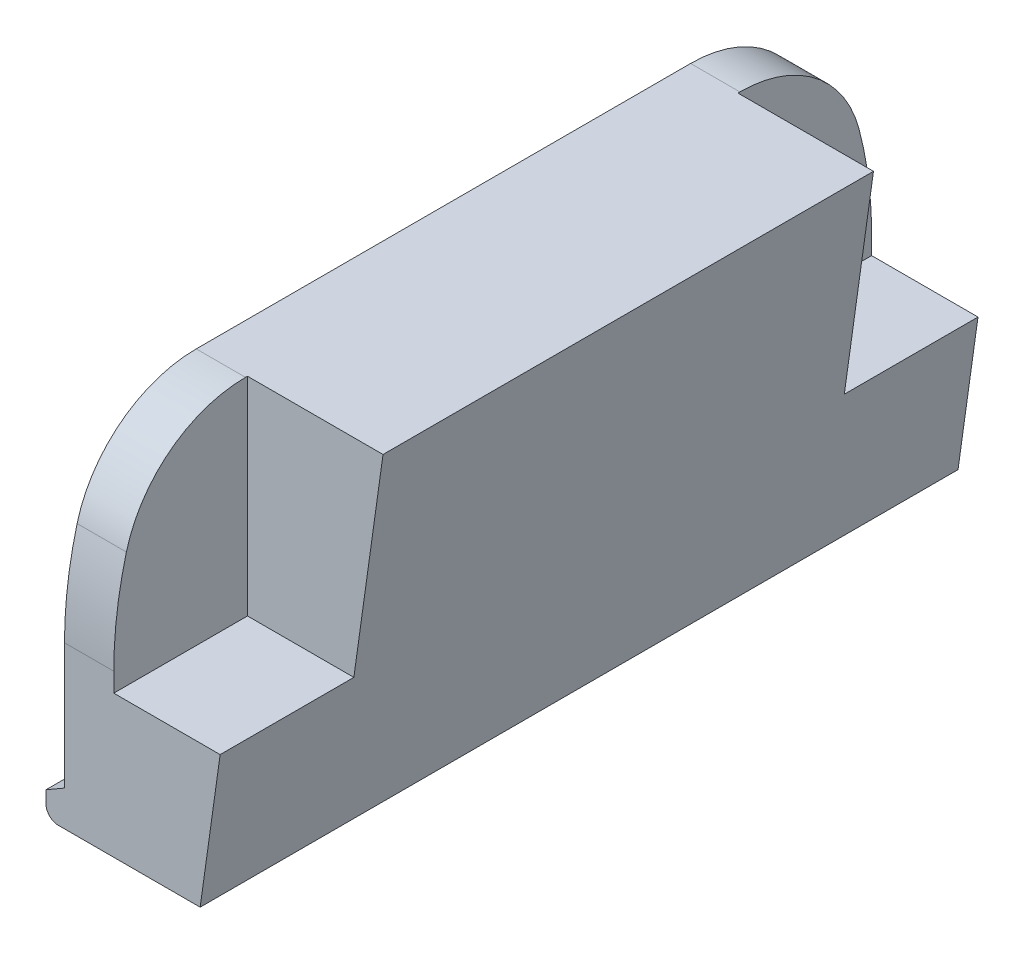
ISO-10303-21;
HEADER;
FILE_DESCRIPTION(('STEP AP214'),'2;1');
FILE_NAME('part.step','',(''),(''),'','','');
FILE_SCHEMA(('AUTOMOTIVE_DESIGN { 1 0 10303 214 1 1 1 1 }'));
ENDSEC;
DATA;
#1=APPLICATION_CONTEXT('core data for automotive mechanical design processes');
#2=APPLICATION_PROTOCOL_DEFINITION('international standard','automotive_design',2000,#1);
#3=PRODUCT_CONTEXT('',#1,'mechanical');
#4=PRODUCT('Part','Part','',(#3));
#5=PRODUCT_RELATED_PRODUCT_CATEGORY('part','',(#4));
#6=PRODUCT_DEFINITION_FORMATION('','',#4);
#7=PRODUCT_DEFINITION_CONTEXT('part definition',#1,'design');
#8=PRODUCT_DEFINITION('design','',#6,#7);
#9=PRODUCT_DEFINITION_SHAPE('','',#8);
#10=(LENGTH_UNIT() NAMED_UNIT(*) SI_UNIT(.MILLI.,.METRE.));
#11=(NAMED_UNIT(*) PLANE_ANGLE_UNIT() SI_UNIT($,.RADIAN.));
#12=(NAMED_UNIT(*) SI_UNIT($,.STERADIAN.) SOLID_ANGLE_UNIT());
#13=UNCERTAINTY_MEASURE_WITH_UNIT(LENGTH_MEASURE(1.E-05),#10,'distance_accuracy_value','');
#14=(GEOMETRIC_REPRESENTATION_CONTEXT(3) GLOBAL_UNCERTAINTY_ASSIGNED_CONTEXT((#13)) GLOBAL_UNIT_ASSIGNED_CONTEXT((#10,
#11,#12)) REPRESENTATION_CONTEXT('',''));
#15=CARTESIAN_POINT('',(0.,0.,0.));
#16=DIRECTION('',(0.,0.,1.));
#17=DIRECTION('',(1.,0.,0.));
#18=AXIS2_PLACEMENT_3D('',#15,#16,#17);
#19=CARTESIAN_POINT('',(0.299997713090983,1.78159871871872,12.3));
#20=DIRECTION('',(1.,0.,0.));
#21=DIRECTION('',(0.,0.,-1.));
#22=AXIS2_PLACEMENT_3D('',#19,#20,#21);
#23=PLANE('',#22);
#24=CARTESIAN_POINT('',(0.299997713090983,2.21592966698313,6.14964107341044));
#25=DIRECTION('',(1.,0.,0.));
#26=DIRECTION('',(0.,0.,1.));
#27=AXIS2_PLACEMENT_3D('',#24,#25,#26);
#28=CIRCLE('',#27,6.15035892658956);
#29=CARTESIAN_POINT('',(0.299997713090983,3.78899475901144,12.095427913024));
#30=VERTEX_POINT('',#29);
#31=CARTESIAN_POINT('',(0.299997713090983,2.21592966698313,12.3));
#32=VERTEX_POINT('',#31);
#33=EDGE_CURVE('E248',#30,#32,#28,.T.);
#34=ORIENTED_EDGE('',*,*,#33,.F.);
#35=CARTESIAN_POINT('',(0.299997713090983,3.27745872971482,10.1619515385287));
#36=DIRECTION('',(1.,0.,0.));
#37=DIRECTION('',(0.,0.,-1.));
#38=AXIS2_PLACEMENT_3D('',#35,#36,#37);
#39=CIRCLE('',#38,2.);
#40=CARTESIAN_POINT('',(0.299997713090983,5.27745872971482,10.1619515385287));
#41=VERTEX_POINT('',#40);
#42=EDGE_CURVE('E227',#30,#41,#39,.F.);
#43=ORIENTED_EDGE('',*,*,#42,.T.);
#44=DIRECTION('',(0.,0.,1.));
#45=VECTOR('',#44,1.);
#46=CARTESIAN_POINT('',(0.299997713090983,5.27745872971482,-0.552242211652792));
#47=LINE('',#46,#45);
#48=CARTESIAN_POINT('',(0.299997713090983,5.27745872971482,2.13804846147129));
#49=VERTEX_POINT('',#48);
#50=EDGE_CURVE('E318',#49,#41,#47,.T.);
#51=ORIENTED_EDGE('',*,*,#50,.F.);
#52=CARTESIAN_POINT('',(0.299997713090983,3.27745872971482,2.13804846147129));
#53=DIRECTION('',(1.,0.,0.));
#54=DIRECTION('',(0.,0.,-1.));
#55=AXIS2_PLACEMENT_3D('',#52,#53,#54);
#56=CIRCLE('',#55,2.);
#57=CARTESIAN_POINT('',(0.299997713090983,3.78899475901144,0.204572086976));
#58=VERTEX_POINT('',#57);
#59=EDGE_CURVE('E225',#49,#58,#56,.F.);
#60=ORIENTED_EDGE('',*,*,#59,.T.);
#61=CARTESIAN_POINT('',(0.299997713090983,2.21592966698313,6.15035892658956));
#62=DIRECTION('',(1.,0.,0.));
#63=DIRECTION('',(0.,0.,-1.));
#64=AXIS2_PLACEMENT_3D('',#61,#62,#63);
#65=CIRCLE('',#64,6.15035892658956);
#66=CARTESIAN_POINT('',(0.299997713090983,2.21592966698313,0.));
#67=VERTEX_POINT('',#66);
#68=EDGE_CURVE('E240',#67,#58,#65,.T.);
#69=ORIENTED_EDGE('',*,*,#68,.F.);
#70=DIRECTION('',(0.,-1.,0.));
#71=VECTOR('',#70,1.);
#72=CARTESIAN_POINT('',(0.299997713090983,1.78159871871872,0.));
#73=LINE('',#72,#71);
#74=CARTESIAN_POINT('',(0.299997713090983,0.173208718718719,0.));
#75=VERTEX_POINT('',#74);
#76=EDGE_CURVE('E200',#67,#75,#73,.T.);
#77=ORIENTED_EDGE('',*,*,#76,.T.);
#78=DIRECTION('',(0.,0.,-1.));
#79=VECTOR('',#78,1.);
#80=CARTESIAN_POINT('',(0.299997713090983,0.173208718718719,12.3));
#81=LINE('',#80,#79);
#82=CARTESIAN_POINT('',(0.299997713090983,0.173208718718719,12.3));
#83=VERTEX_POINT('',#82);
#84=EDGE_CURVE('E214',#83,#75,#81,.T.);
#85=ORIENTED_EDGE('',*,*,#84,.F.);
#86=DIRECTION('',(0.,-1.,0.));
#87=VECTOR('',#86,1.);
#88=CARTESIAN_POINT('',(0.299997713090982,6.10745871871872,12.3));
#89=LINE('',#88,#87);
#90=EDGE_CURVE('E294',#32,#83,#89,.T.);
#91=ORIENTED_EDGE('',*,*,#90,.F.);
#92=EDGE_LOOP('',(#34,#43,#51,#60,#69,#77,#85,#91));
#93=FACE_BOUND('',#92,.T.);
#94=DIRECTION('',(0.,0.,1.));
#95=VECTOR('',#94,1.);
#96=CARTESIAN_POINT('',(0.299997713090983,4.37320871871872,2.9660396702713));
#97=LINE('',#96,#95);
#98=CARTESIAN_POINT('',(0.299997713090983,4.37320871871872,4.65));
#99=VERTEX_POINT('',#98);
#100=CARTESIAN_POINT('',(0.299997713090983,4.37320871871872,7.65));
#101=VERTEX_POINT('',#100);
#102=EDGE_CURVE('E341',#99,#101,#97,.T.);
#103=ORIENTED_EDGE('',*,*,#102,.T.);
#104=DIRECTION('',(0.,1.,0.));
#105=VECTOR('',#104,1.);
#106=CARTESIAN_POINT('',(0.299997713090983,2.78159871871872,7.65));
#107=LINE('',#106,#105);
#108=CARTESIAN_POINT('',(0.299997713090983,1.78159871871872,7.65));
#109=VERTEX_POINT('',#108);
#110=EDGE_CURVE('E350',#109,#101,#107,.T.);
#111=ORIENTED_EDGE('',*,*,#110,.F.);
#112=DIRECTION('',(0.,0.,1.));
#113=VECTOR('',#112,1.);
#114=CARTESIAN_POINT('',(0.299997713090983,1.78159871871872,4.65));
#115=LINE('',#114,#113);
#116=CARTESIAN_POINT('',(0.299997713090983,1.78159871871872,4.65));
#117=VERTEX_POINT('',#116);
#118=EDGE_CURVE('E361',#117,#109,#115,.T.);
#119=ORIENTED_EDGE('',*,*,#118,.F.);
#120=DIRECTION('',(0.,-1.,0.));
#121=VECTOR('',#120,1.);
#122=CARTESIAN_POINT('',(0.299997713090983,2.78159871871872,4.65));
#123=LINE('',#122,#121);
#124=EDGE_CURVE('E340',#99,#117,#123,.T.);
#125=ORIENTED_EDGE('',*,*,#124,.F.);
#126=EDGE_LOOP('',(#103,#111,#119,#125));
#127=FACE_BOUND('',#126,.T.);
#128=ADVANCED_FACE('F33',(#93,#127),#23,.F.);
#129=CARTESIAN_POINT('',(0.2,-0.2,0.));
#130=DIRECTION('',(0.,0.,-1.));
#131=DIRECTION('',(-1.,0.,0.));
#132=AXIS2_PLACEMENT_3D('',#129,#130,#131);
#133=PLANE('',#132);
#134=DIRECTION('',(-0.139173100960058,-0.990268068741571,0.));
#135=VECTOR('',#134,1.);
#136=CARTESIAN_POINT('',(2.50208292422852,-0.4,0.));
#137=LINE('',#136,#135);
#138=CARTESIAN_POINT('',(2.82637509859855,1.90745871871872,0.));
#139=VERTEX_POINT('',#138);
#140=CARTESIAN_POINT('',(2.50208292422852,-0.4,0.));
#141=VERTEX_POINT('',#140);
#142=EDGE_CURVE('E178',#139,#141,#137,.T.);
#143=ORIENTED_EDGE('',*,*,#142,.T.);
#144=DIRECTION('',(1.,0.,0.));
#145=VECTOR('',#144,1.);
#146=CARTESIAN_POINT('',(3.29999771309098,-0.399999999999999,0.));
#147=LINE('',#146,#145);
#148=CARTESIAN_POINT('',(0.200000000000001,-0.4,0.));
#149=VERTEX_POINT('',#148);
#150=EDGE_CURVE('E192',#149,#141,#147,.T.);
#151=ORIENTED_EDGE('',*,*,#150,.F.);
#152=CARTESIAN_POINT('',(0.2,-0.2,0.));
#153=DIRECTION('',(0.,0.,1.));
#154=DIRECTION('',(-1.,0.,0.));
#155=AXIS2_PLACEMENT_3D('',#152,#153,#154);
#156=CIRCLE('',#155,0.2);
#157=CARTESIAN_POINT('',(0.,-0.199999999999999,0.));
#158=VERTEX_POINT('',#157);
#159=EDGE_CURVE('E201',#158,#149,#156,.T.);
#160=ORIENTED_EDGE('',*,*,#159,.F.);
#161=DIRECTION('',(0.,-1.,0.));
#162=VECTOR('',#161,1.);
#163=CARTESIAN_POINT('',(0.,0.,0.));
#164=LINE('',#163,#162);
#165=CARTESIAN_POINT('',(0.,0.,0.));
#166=VERTEX_POINT('',#165);
#167=EDGE_CURVE('E205',#166,#158,#164,.T.);
#168=ORIENTED_EDGE('',*,*,#167,.F.);
#169=DIRECTION('',(-0.866019205828305,-0.500010735021271,0.));
#170=VECTOR('',#169,1.);
#171=CARTESIAN_POINT('',(0.,0.,0.));
#172=LINE('',#171,#170);
#173=EDGE_CURVE('E203',#75,#166,#172,.T.);
#174=ORIENTED_EDGE('',*,*,#173,.F.);
#175=ORIENTED_EDGE('',*,*,#76,.F.);
#176=DIRECTION('',(-1.,0.,0.));
#177=VECTOR('',#176,1.);
#178=CARTESIAN_POINT('',(5.42551835218583,2.21592966698313,0.));
#179=LINE('',#178,#177);
#180=CARTESIAN_POINT('',(1.09999771309098,2.21592966698313,0.));
#181=VERTEX_POINT('',#180);
#182=EDGE_CURVE('E249',#181,#67,#179,.T.);
#183=ORIENTED_EDGE('',*,*,#182,.F.);
#184=DIRECTION('',(0.,1.,0.));
#185=VECTOR('',#184,1.);
#186=CARTESIAN_POINT('',(1.09999771309098,1.90745871871872,0.));
#187=LINE('',#186,#185);
#188=CARTESIAN_POINT('',(1.09999771309098,1.90745871871872,0.));
#189=VERTEX_POINT('',#188);
#190=EDGE_CURVE('E247',#189,#181,#187,.T.);
#191=ORIENTED_EDGE('',*,*,#190,.F.);
#192=DIRECTION('',(-1.,0.,0.));
#193=VECTOR('',#192,1.);
#194=CARTESIAN_POINT('',(3.29999771309098,1.90745871871872,0.));
#195=LINE('',#194,#193);
#196=EDGE_CURVE('E194',#139,#189,#195,.T.);
#197=ORIENTED_EDGE('',*,*,#196,.F.);
#198=EDGE_LOOP('',(#143,#151,#160,#168,#174,#175,#183,#191,#197));
#199=FACE_BOUND('',#198,.T.);
#200=ADVANCED_FACE('F191',(#199),#133,.T.);
#201=CARTESIAN_POINT('',(0.2,-0.2,12.3));
#202=DIRECTION('',(0.,0.,-1.));
#203=DIRECTION('',(-1.,0.,0.));
#204=AXIS2_PLACEMENT_3D('',#201,#202,#203);
#205=PLANE('',#204);
#206=DIRECTION('',(1.,0.,0.));
#207=VECTOR('',#206,1.);
#208=CARTESIAN_POINT('',(3.29999771309098,-0.399999999999999,12.3));
#209=LINE('',#208,#207);
#210=CARTESIAN_POINT('',(0.200000000000001,-0.4,12.3));
#211=VERTEX_POINT('',#210);
#212=CARTESIAN_POINT('',(2.50208292422852,-0.4,12.3));
#213=VERTEX_POINT('',#212);
#214=EDGE_CURVE('E292',#211,#213,#209,.T.);
#215=ORIENTED_EDGE('',*,*,#214,.T.);
#216=DIRECTION('',(-0.139173100960058,-0.990268068741571,0.));
#217=VECTOR('',#216,1.);
#218=CARTESIAN_POINT('',(2.50208292422852,-0.4,12.3));
#219=LINE('',#218,#217);
#220=CARTESIAN_POINT('',(2.82637509859855,1.90745871871872,12.3));
#221=VERTEX_POINT('',#220);
#222=EDGE_CURVE('E181',#221,#213,#219,.T.);
#223=ORIENTED_EDGE('',*,*,#222,.F.);
#224=DIRECTION('',(1.,0.,0.));
#225=VECTOR('',#224,1.);
#226=CARTESIAN_POINT('',(3.29999771309098,1.90745871871872,12.3));
#227=LINE('',#226,#225);
#228=CARTESIAN_POINT('',(1.09999771309098,1.90745871871872,12.3));
#229=VERTEX_POINT('',#228);
#230=EDGE_CURVE('E268',#229,#221,#227,.T.);
#231=ORIENTED_EDGE('',*,*,#230,.F.);
#232=DIRECTION('',(0.,1.,0.));
#233=VECTOR('',#232,1.);
#234=CARTESIAN_POINT('',(1.09999771309098,1.90745871871872,12.3));
#235=LINE('',#234,#233);
#236=CARTESIAN_POINT('',(1.09999771309098,2.21592966698313,12.3));
#237=VERTEX_POINT('',#236);
#238=EDGE_CURVE('E272',#229,#237,#235,.T.);
#239=ORIENTED_EDGE('',*,*,#238,.T.);
#240=DIRECTION('',(-1.,0.,0.));
#241=VECTOR('',#240,1.);
#242=CARTESIAN_POINT('',(5.42551835218583,2.21592966698313,12.3));
#243=LINE('',#242,#241);
#244=EDGE_CURVE('E251',#237,#32,#243,.T.);
#245=ORIENTED_EDGE('',*,*,#244,.T.);
#246=ORIENTED_EDGE('',*,*,#90,.T.);
#247=DIRECTION('',(-0.866019205828305,-0.500010735021271,0.));
#248=VECTOR('',#247,1.);
#249=CARTESIAN_POINT('',(0.,0.,12.3));
#250=LINE('',#249,#248);
#251=CARTESIAN_POINT('',(0.,0.,12.3));
#252=VERTEX_POINT('',#251);
#253=EDGE_CURVE('E215',#83,#252,#250,.T.);
#254=ORIENTED_EDGE('',*,*,#253,.T.);
#255=DIRECTION('',(0.,-1.,0.));
#256=VECTOR('',#255,1.);
#257=CARTESIAN_POINT('',(0.,0.,12.3));
#258=LINE('',#257,#256);
#259=CARTESIAN_POINT('',(0.,-0.199999999999999,12.3));
#260=VERTEX_POINT('',#259);
#261=EDGE_CURVE('E210',#252,#260,#258,.T.);
#262=ORIENTED_EDGE('',*,*,#261,.T.);
#263=CARTESIAN_POINT('',(0.2,-0.2,12.3));
#264=DIRECTION('',(0.,0.,1.));
#265=DIRECTION('',(-1.,0.,0.));
#266=AXIS2_PLACEMENT_3D('',#263,#264,#265);
#267=CIRCLE('',#266,0.2);
#268=EDGE_CURVE('E290',#260,#211,#267,.T.);
#269=ORIENTED_EDGE('',*,*,#268,.T.);
#270=EDGE_LOOP('',(#215,#223,#231,#239,#245,#246,#254,#262,#269));
#271=FACE_BOUND('',#270,.T.);
#272=ADVANCED_FACE('F308',(#271),#205,.F.);
#273=CARTESIAN_POINT('',(0.,0.,12.3));
#274=DIRECTION('',(1.,0.,0.));
#275=DIRECTION('',(0.,1.,0.));
#276=AXIS2_PLACEMENT_3D('',#273,#274,#275);
#277=PLANE('',#276);
#278=ORIENTED_EDGE('',*,*,#167,.T.);
#279=DIRECTION('',(0.,0.,-1.));
#280=VECTOR('',#279,1.);
#281=CARTESIAN_POINT('',(0.,-0.199999999999999,12.3));
#282=LINE('',#281,#280);
#283=EDGE_CURVE('E219',#260,#158,#282,.T.);
#284=ORIENTED_EDGE('',*,*,#283,.F.);
#285=ORIENTED_EDGE('',*,*,#261,.F.);
#286=DIRECTION('',(0.,0.,-1.));
#287=VECTOR('',#286,1.);
#288=CARTESIAN_POINT('',(0.,0.,12.3));
#289=LINE('',#288,#287);
#290=EDGE_CURVE('E211',#252,#166,#289,.T.);
#291=ORIENTED_EDGE('',*,*,#290,.T.);
#292=EDGE_LOOP('',(#278,#284,#285,#291));
#293=FACE_BOUND('',#292,.T.);
#294=ADVANCED_FACE('F300',(#293),#277,.F.);
#295=CARTESIAN_POINT('',(0.2,-0.2,12.3));
#296=DIRECTION('',(0.,0.,-1.));
#297=DIRECTION('',(-1.,0.,0.));
#298=AXIS2_PLACEMENT_3D('',#295,#296,#297);
#299=CYLINDRICAL_SURFACE('',#298,0.2);
#300=ORIENTED_EDGE('',*,*,#159,.T.);
#301=DIRECTION('',(0.,0.,-1.));
#302=VECTOR('',#301,1.);
#303=CARTESIAN_POINT('',(0.200000000000001,-0.4,12.3));
#304=LINE('',#303,#302);
#305=EDGE_CURVE('E199',#211,#149,#304,.T.);
#306=ORIENTED_EDGE('',*,*,#305,.F.);
#307=ORIENTED_EDGE('',*,*,#268,.F.);
#308=ORIENTED_EDGE('',*,*,#283,.T.);
#309=EDGE_LOOP('',(#300,#306,#307,#308));
#310=FACE_BOUND('',#309,.T.);
#311=ADVANCED_FACE('F306',(#310),#299,.T.);
#312=CARTESIAN_POINT('',(3.29999771309098,-0.399999999999999,12.3));
#313=DIRECTION('',(0.,1.,0.));
#314=DIRECTION('',(-1.,0.,0.));
#315=AXIS2_PLACEMENT_3D('',#312,#313,#314);
#316=PLANE('',#315);
#317=ORIENTED_EDGE('',*,*,#150,.T.);
#318=DIRECTION('',(0.,0.,1.));
#319=VECTOR('',#318,1.);
#320=CARTESIAN_POINT('',(2.50208292422852,-0.4,0.));
#321=LINE('',#320,#319);
#322=EDGE_CURVE('E175',#141,#213,#321,.T.);
#323=ORIENTED_EDGE('',*,*,#322,.T.);
#324=ORIENTED_EDGE('',*,*,#214,.F.);
#325=ORIENTED_EDGE('',*,*,#305,.T.);
#326=EDGE_LOOP('',(#317,#323,#324,#325));
#327=FACE_BOUND('',#326,.T.);
#328=ADVANCED_FACE('F197',(#327),#316,.F.);
#329=CARTESIAN_POINT('',(0.,0.,12.3));
#330=DIRECTION('',(0.500010735021271,-0.866019205828305,0.));
#331=DIRECTION('',(0.866019205828305,0.500010735021271,0.));
#332=AXIS2_PLACEMENT_3D('',#329,#330,#331);
#333=PLANE('',#332);
#334=ORIENTED_EDGE('',*,*,#173,.T.);
#335=ORIENTED_EDGE('',*,*,#290,.F.);
#336=ORIENTED_EDGE('',*,*,#253,.F.);
#337=ORIENTED_EDGE('',*,*,#84,.T.);
#338=EDGE_LOOP('',(#334,#335,#336,#337));
#339=FACE_BOUND('',#338,.T.);
#340=ADVANCED_FACE('F313',(#339),#333,.F.);
#341=CARTESIAN_POINT('',(3.29999771309098,1.90745871871872,2.17));
#342=DIRECTION('',(0.,0.,1.));
#343=DIRECTION('',(1.,0.,0.));
#344=AXIS2_PLACEMENT_3D('',#341,#342,#343);
#345=PLANE('',#344);
#346=DIRECTION('',(1.,0.,0.));
#347=VECTOR('',#346,1.);
#348=CARTESIAN_POINT('',(3.29999771309098,5.27745872971482,2.17));
#349=LINE('',#348,#347);
#350=CARTESIAN_POINT('',(1.09999771309098,5.27745872971482,2.17));
#351=VERTEX_POINT('',#350);
#352=CARTESIAN_POINT('',(3.29999771309098,5.27745872971482,2.17));
#353=VERTEX_POINT('',#352);
#354=EDGE_CURVE('E324',#351,#353,#349,.T.);
#355=ORIENTED_EDGE('',*,*,#354,.T.);
#356=DIRECTION('',(-0.139173100960058,-0.990268068741571,0.));
#357=VECTOR('',#356,1.);
#358=CARTESIAN_POINT('',(2.83554876702389,1.97273276127563,2.17));
#359=LINE('',#358,#357);
#360=CARTESIAN_POINT('',(2.82637509859855,1.90745871871872,2.17));
#361=VERTEX_POINT('',#360);
#362=EDGE_CURVE('E437',#353,#361,#359,.T.);
#363=ORIENTED_EDGE('',*,*,#362,.T.);
#364=DIRECTION('',(1.,0.,0.));
#365=VECTOR('',#364,1.);
#366=CARTESIAN_POINT('',(3.29999771309098,1.90745871871872,2.17));
#367=LINE('',#366,#365);
#368=CARTESIAN_POINT('',(1.09999771309098,1.90745871871872,2.17));
#369=VERTEX_POINT('',#368);
#370=EDGE_CURVE('E281',#369,#361,#367,.T.);
#371=ORIENTED_EDGE('',*,*,#370,.F.);
#372=DIRECTION('',(0.,1.,0.));
#373=VECTOR('',#372,1.);
#374=CARTESIAN_POINT('',(1.09999771309098,1.90745871871872,2.17));
#375=LINE('',#374,#373);
#376=EDGE_CURVE('E284',#369,#351,#375,.T.);
#377=ORIENTED_EDGE('',*,*,#376,.T.);
#378=EDGE_LOOP('',(#355,#363,#371,#377));
#379=FACE_BOUND('',#378,.T.);
#380=ADVANCED_FACE('F435',(#379),#345,.F.);
#381=CARTESIAN_POINT('',(1.09999771309098,1.90745871871872,0.));
#382=DIRECTION('',(-1.,0.,0.));
#383=DIRECTION('',(0.,0.,1.));
#384=AXIS2_PLACEMENT_3D('',#381,#382,#383);
#385=PLANE('',#384);
#386=CARTESIAN_POINT('',(1.09999771309098,2.21592966698313,6.15035892658956));
#387=DIRECTION('',(-1.,0.,0.));
#388=DIRECTION('',(0.,0.,1.));
#389=AXIS2_PLACEMENT_3D('',#386,#387,#388);
#390=CIRCLE('',#389,6.15035892658956);
#391=CARTESIAN_POINT('',(1.09999771309098,3.78899475901144,0.204572086976));
#392=VERTEX_POINT('',#391);
#393=EDGE_CURVE('E237',#392,#181,#390,.T.);
#394=ORIENTED_EDGE('',*,*,#393,.F.);
#395=CARTESIAN_POINT('',(1.09999771309098,3.27745872971482,2.13804846147129));
#396=DIRECTION('',(-1.,0.,0.));
#397=DIRECTION('',(0.,0.,1.));
#398=AXIS2_PLACEMENT_3D('',#395,#396,#397);
#399=CIRCLE('',#398,2.);
#400=CARTESIAN_POINT('',(1.09999771309098,5.27745872971482,2.13804846147129));
#401=VERTEX_POINT('',#400);
#402=EDGE_CURVE('E11',#392,#401,#399,.F.);
#403=ORIENTED_EDGE('',*,*,#402,.T.);
#404=DIRECTION('',(0.,0.,1.));
#405=VECTOR('',#404,1.);
#406=CARTESIAN_POINT('',(1.09999771309098,5.27745872971482,0.));
#407=LINE('',#406,#405);
#408=EDGE_CURVE('E321',#401,#351,#407,.T.);
#409=ORIENTED_EDGE('',*,*,#408,.T.);
#410=ORIENTED_EDGE('',*,*,#376,.F.);
#411=DIRECTION('',(0.,0.,1.));
#412=VECTOR('',#411,1.);
#413=CARTESIAN_POINT('',(1.09999771309098,1.90745871871872,0.));
#414=LINE('',#413,#412);
#415=EDGE_CURVE('E278',#189,#369,#414,.T.);
#416=ORIENTED_EDGE('',*,*,#415,.F.);
#417=ORIENTED_EDGE('',*,*,#190,.T.);
#418=EDGE_LOOP('',(#394,#403,#409,#410,#416,#417));
#419=FACE_BOUND('',#418,.T.);
#420=ADVANCED_FACE('F244',(#419),#385,.F.);
#421=CARTESIAN_POINT('',(0.,1.90745871871872,0.));
#422=DIRECTION('',(0.,-1.,0.));
#423=DIRECTION('',(0.,0.,-1.));
#424=AXIS2_PLACEMENT_3D('',#421,#422,#423);
#425=PLANE('',#424);
#426=ORIENTED_EDGE('',*,*,#370,.T.);
#427=DIRECTION('',(0.,0.,-1.));
#428=VECTOR('',#427,1.);
#429=CARTESIAN_POINT('',(2.82637509859855,1.90745871871872,0.));
#430=LINE('',#429,#428);
#431=EDGE_CURVE('E440',#361,#139,#430,.T.);
#432=ORIENTED_EDGE('',*,*,#431,.T.);
#433=ORIENTED_EDGE('',*,*,#196,.T.);
#434=ORIENTED_EDGE('',*,*,#415,.T.);
#435=EDGE_LOOP('',(#426,#432,#433,#434));
#436=FACE_BOUND('',#435,.T.);
#437=ADVANCED_FACE('F439',(#436),#425,.F.);
#438=CARTESIAN_POINT('',(1.09999771309098,1.90745871871872,12.3));
#439=DIRECTION('',(-1.,0.,0.));
#440=DIRECTION('',(0.,0.,1.));
#441=AXIS2_PLACEMENT_3D('',#438,#439,#440);
#442=PLANE('',#441);
#443=DIRECTION('',(0.,0.,1.));
#444=VECTOR('',#443,1.);
#445=CARTESIAN_POINT('',(1.09999771309098,5.27745872971482,12.3));
#446=LINE('',#445,#444);
#447=CARTESIAN_POINT('',(1.09999771309098,5.27745872971482,10.13));
#448=VERTEX_POINT('',#447);
#449=CARTESIAN_POINT('',(1.09999771309098,5.27745872971482,10.1619515385287));
#450=VERTEX_POINT('',#449);
#451=EDGE_CURVE('E327',#448,#450,#446,.T.);
#452=ORIENTED_EDGE('',*,*,#451,.T.);
#453=CARTESIAN_POINT('',(1.09999771309098,3.27745872971482,10.1619515385287));
#454=DIRECTION('',(-1.,0.,0.));
#455=DIRECTION('',(0.,0.,1.));
#456=AXIS2_PLACEMENT_3D('',#453,#454,#455);
#457=CIRCLE('',#456,2.);
#458=CARTESIAN_POINT('',(1.09999771309098,3.78899475901144,12.095427913024));
#459=VERTEX_POINT('',#458);
#460=EDGE_CURVE('E232',#450,#459,#457,.F.);
#461=ORIENTED_EDGE('',*,*,#460,.T.);
#462=CARTESIAN_POINT('',(1.09999771309098,2.21592966698313,6.14964107341044));
#463=DIRECTION('',(-1.,0.,0.));
#464=DIRECTION('',(0.,0.,1.));
#465=AXIS2_PLACEMENT_3D('',#462,#463,#464);
#466=CIRCLE('',#465,6.15035892658956);
#467=EDGE_CURVE('E259',#237,#459,#466,.T.);
#468=ORIENTED_EDGE('',*,*,#467,.F.);
#469=ORIENTED_EDGE('',*,*,#238,.F.);
#470=DIRECTION('',(0.,0.,1.));
#471=VECTOR('',#470,1.);
#472=CARTESIAN_POINT('',(1.09999771309098,1.90745871871872,12.3));
#473=LINE('',#472,#471);
#474=CARTESIAN_POINT('',(1.09999771309098,1.90745871871872,10.13));
#475=VERTEX_POINT('',#474);
#476=EDGE_CURVE('E266',#475,#229,#473,.T.);
#477=ORIENTED_EDGE('',*,*,#476,.F.);
#478=DIRECTION('',(0.,1.,0.));
#479=VECTOR('',#478,1.);
#480=CARTESIAN_POINT('',(1.09999771309098,1.90745871871872,10.13));
#481=LINE('',#480,#479);
#482=EDGE_CURVE('E271',#475,#448,#481,.T.);
#483=ORIENTED_EDGE('',*,*,#482,.T.);
#484=EDGE_LOOP('',(#452,#461,#468,#469,#477,#483));
#485=FACE_BOUND('',#484,.T.);
#486=ADVANCED_FACE('F417',(#485),#442,.F.);
#487=CARTESIAN_POINT('',(3.29999771309098,1.90745871871872,10.13));
#488=DIRECTION('',(0.,0.,-1.));
#489=DIRECTION('',(-1.,0.,0.));
#490=AXIS2_PLACEMENT_3D('',#487,#488,#489);
#491=PLANE('',#490);
#492=DIRECTION('',(-1.,0.,0.));
#493=VECTOR('',#492,1.);
#494=CARTESIAN_POINT('',(3.29999771309098,1.90745871871872,10.13));
#495=LINE('',#494,#493);
#496=CARTESIAN_POINT('',(2.82637509859855,1.90745871871872,10.13));
#497=VERTEX_POINT('',#496);
#498=EDGE_CURVE('E261',#497,#475,#495,.T.);
#499=ORIENTED_EDGE('',*,*,#498,.F.);
#500=DIRECTION('',(0.139173100960058,0.990268068741571,0.));
#501=VECTOR('',#500,1.);
#502=CARTESIAN_POINT('',(2.83554876702389,1.97273276127563,10.13));
#503=LINE('',#502,#501);
#504=CARTESIAN_POINT('',(3.29999771309098,5.27745872971482,10.13));
#505=VERTEX_POINT('',#504);
#506=EDGE_CURVE('E432',#497,#505,#503,.T.);
#507=ORIENTED_EDGE('',*,*,#506,.T.);
#508=DIRECTION('',(-1.,0.,0.));
#509=VECTOR('',#508,1.);
#510=CARTESIAN_POINT('',(3.29999771309098,5.27745872971482,10.13));
#511=LINE('',#510,#509);
#512=EDGE_CURVE('E333',#505,#448,#511,.T.);
#513=ORIENTED_EDGE('',*,*,#512,.T.);
#514=ORIENTED_EDGE('',*,*,#482,.F.);
#515=EDGE_LOOP('',(#499,#507,#513,#514));
#516=FACE_BOUND('',#515,.T.);
#517=ADVANCED_FACE('F430',(#516),#491,.F.);
#518=CARTESIAN_POINT('',(0.,1.90745871871872,0.));
#519=DIRECTION('',(0.,1.,0.));
#520=DIRECTION('',(0.,0.,1.));
#521=AXIS2_PLACEMENT_3D('',#518,#519,#520);
#522=PLANE('',#521);
#523=DIRECTION('',(0.,0.,1.));
#524=VECTOR('',#523,1.);
#525=CARTESIAN_POINT('',(2.82637509859855,1.90745871871872,0.));
#526=LINE('',#525,#524);
#527=EDGE_CURVE('E186',#497,#221,#526,.T.);
#528=ORIENTED_EDGE('',*,*,#527,.F.);
#529=ORIENTED_EDGE('',*,*,#498,.T.);
#530=ORIENTED_EDGE('',*,*,#476,.T.);
#531=ORIENTED_EDGE('',*,*,#230,.T.);
#532=EDGE_LOOP('',(#528,#529,#530,#531));
#533=FACE_BOUND('',#532,.T.);
#534=ADVANCED_FACE('F426',(#533),#522,.T.);
#535=CARTESIAN_POINT('',(5.42551835218583,2.21592966698313,6.14964107341044));
#536=DIRECTION('',(-1.,0.,0.));
#537=DIRECTION('',(0.,0.,1.));
#538=AXIS2_PLACEMENT_3D('',#535,#536,#537);
#539=CYLINDRICAL_SURFACE('',#538,6.15035892658956);
#540=ORIENTED_EDGE('',*,*,#467,.T.);
#541=DIRECTION('',(-1.,0.,0.));
#542=VECTOR('',#541,1.);
#543=CARTESIAN_POINT('',(5.42551835218583,3.78899475901144,12.095427913024));
#544=LINE('',#543,#542);
#545=EDGE_CURVE('E222',#459,#30,#544,.T.);
#546=ORIENTED_EDGE('',*,*,#545,.T.);
#547=ORIENTED_EDGE('',*,*,#33,.T.);
#548=ORIENTED_EDGE('',*,*,#244,.F.);
#549=EDGE_LOOP('',(#540,#546,#547,#548));
#550=FACE_BOUND('',#549,.T.);
#551=ADVANCED_FACE('F420',(#550),#539,.T.);
#552=CARTESIAN_POINT('',(5.42551835218583,2.21592966698313,6.15035892658956));
#553=DIRECTION('',(-1.,0.,0.));
#554=DIRECTION('',(0.,0.,1.));
#555=AXIS2_PLACEMENT_3D('',#552,#553,#554);
#556=CYLINDRICAL_SURFACE('',#555,6.15035892658956);
#557=ORIENTED_EDGE('',*,*,#68,.T.);
#558=DIRECTION('',(-1.,0.,0.));
#559=VECTOR('',#558,1.);
#560=CARTESIAN_POINT('',(5.42551835218583,3.78899475901144,0.204572086976));
#561=LINE('',#560,#559);
#562=EDGE_CURVE('E41',#58,#392,#561,.F.);
#563=ORIENTED_EDGE('',*,*,#562,.T.);
#564=ORIENTED_EDGE('',*,*,#393,.T.);
#565=ORIENTED_EDGE('',*,*,#182,.T.);
#566=EDGE_LOOP('',(#557,#563,#564,#565));
#567=FACE_BOUND('',#566,.T.);
#568=ADVANCED_FACE('F236',(#567),#556,.T.);
#569=CARTESIAN_POINT('',(-0.250002286909017,2.78159871871872,4.65));
#570=DIRECTION('',(0.,0.,1.));
#571=DIRECTION('',(1.,0.,0.));
#572=AXIS2_PLACEMENT_3D('',#569,#570,#571);
#573=PLANE('',#572);
#574=ORIENTED_EDGE('',*,*,#124,.T.);
#575=DIRECTION('',(1.,0.,0.));
#576=VECTOR('',#575,1.);
#577=CARTESIAN_POINT('',(-0.250002286909017,1.78159871871872,4.65));
#578=LINE('',#577,#576);
#579=CARTESIAN_POINT('',(-0.250002286909017,1.78159871871872,4.65));
#580=VERTEX_POINT('',#579);
#581=EDGE_CURVE('E256',#580,#117,#578,.T.);
#582=ORIENTED_EDGE('',*,*,#581,.F.);
#583=DIRECTION('',(0.,-1.,0.));
#584=VECTOR('',#583,1.);
#585=CARTESIAN_POINT('',(-0.250002286909017,2.78159871871872,4.65));
#586=LINE('',#585,#584);
#587=CARTESIAN_POINT('',(-0.250002286909017,2.78159871871872,4.65));
#588=VERTEX_POINT('',#587);
#589=EDGE_CURVE('E346',#588,#580,#586,.T.);
#590=ORIENTED_EDGE('',*,*,#589,.F.);
#591=DIRECTION('',(0.326611019446407,0.945158844838358,0.));
#592=VECTOR('',#591,1.);
#593=CARTESIAN_POINT('',(0.299997713090983,4.37320871871872,4.65));
#594=LINE('',#593,#592);
#595=EDGE_CURVE('E337',#588,#99,#594,.T.);
#596=ORIENTED_EDGE('',*,*,#595,.T.);
#597=EDGE_LOOP('',(#574,#582,#590,#596));
#598=FACE_BOUND('',#597,.T.);
#599=ADVANCED_FACE('F374',(#598),#573,.F.);
#600=CARTESIAN_POINT('',(-0.250002286909017,1.78159871871872,4.65));
#601=DIRECTION('',(0.,1.,0.));
#602=DIRECTION('',(0.,0.,1.));
#603=AXIS2_PLACEMENT_3D('',#600,#601,#602);
#604=PLANE('',#603);
#605=ORIENTED_EDGE('',*,*,#118,.T.);
#606=DIRECTION('',(1.,0.,0.));
#607=VECTOR('',#606,1.);
#608=CARTESIAN_POINT('',(-0.250002286909017,1.78159871871872,7.65));
#609=LINE('',#608,#607);
#610=CARTESIAN_POINT('',(-0.250002286909017,1.78159871871872,7.65));
#611=VERTEX_POINT('',#610);
#612=EDGE_CURVE('E358',#611,#109,#609,.T.);
#613=ORIENTED_EDGE('',*,*,#612,.F.);
#614=DIRECTION('',(0.,0.,1.));
#615=VECTOR('',#614,1.);
#616=CARTESIAN_POINT('',(-0.250002286909017,1.78159871871872,4.65));
#617=LINE('',#616,#615);
#618=EDGE_CURVE('E349',#580,#611,#617,.T.);
#619=ORIENTED_EDGE('',*,*,#618,.F.);
#620=ORIENTED_EDGE('',*,*,#581,.T.);
#621=EDGE_LOOP('',(#605,#613,#619,#620));
#622=FACE_BOUND('',#621,.T.);
#623=ADVANCED_FACE('F371',(#622),#604,.F.);
#624=CARTESIAN_POINT('',(-0.250002286909017,2.78159871871872,7.65));
#625=DIRECTION('',(0.,0.,-1.));
#626=DIRECTION('',(0.,1.,0.));
#627=AXIS2_PLACEMENT_3D('',#624,#625,#626);
#628=PLANE('',#627);
#629=ORIENTED_EDGE('',*,*,#110,.T.);
#630=DIRECTION('',(-0.326611019446407,-0.945158844838357,0.));
#631=VECTOR('',#630,1.);
#632=CARTESIAN_POINT('',(0.299997713090983,4.37320871871872,7.65));
#633=LINE('',#632,#631);
#634=CARTESIAN_POINT('',(-0.250002286909017,2.78159871871872,7.65));
#635=VERTEX_POINT('',#634);
#636=EDGE_CURVE('E336',#101,#635,#633,.T.);
#637=ORIENTED_EDGE('',*,*,#636,.T.);
#638=DIRECTION('',(0.,1.,0.));
#639=VECTOR('',#638,1.);
#640=CARTESIAN_POINT('',(-0.250002286909017,2.78159871871872,7.65));
#641=LINE('',#640,#639);
#642=EDGE_CURVE('E352',#611,#635,#641,.T.);
#643=ORIENTED_EDGE('',*,*,#642,.F.);
#644=ORIENTED_EDGE('',*,*,#612,.T.);
#645=EDGE_LOOP('',(#629,#637,#643,#644));
#646=FACE_BOUND('',#645,.T.);
#647=ADVANCED_FACE('F377',(#646),#628,.F.);
#648=CARTESIAN_POINT('',(-0.250002286909017,0.,0.));
#649=DIRECTION('',(-1.,0.,0.));
#650=DIRECTION('',(0.,0.,1.));
#651=AXIS2_PLACEMENT_3D('',#648,#649,#650);
#652=PLANE('',#651);
#653=ORIENTED_EDGE('',*,*,#589,.T.);
#654=ORIENTED_EDGE('',*,*,#618,.T.);
#655=ORIENTED_EDGE('',*,*,#642,.T.);
#656=DIRECTION('',(0.,0.,-1.));
#657=VECTOR('',#656,1.);
#658=CARTESIAN_POINT('',(-0.250002286909017,2.78159871871872,4.65));
#659=LINE('',#658,#657);
#660=EDGE_CURVE('E355',#635,#588,#659,.T.);
#661=ORIENTED_EDGE('',*,*,#660,.T.);
#662=EDGE_LOOP('',(#653,#654,#655,#661));
#663=FACE_BOUND('',#662,.T.);
#664=ADVANCED_FACE('F381',(#663),#652,.T.);
#665=CARTESIAN_POINT('',(0.299997713090983,4.37320871871872,2.9660396702713));
#666=DIRECTION('',(-0.945158844838358,0.326611019446407,0.));
#667=DIRECTION('',(-0.326611019446407,-0.945158844838358,0.));
#668=AXIS2_PLACEMENT_3D('',#665,#666,#667);
#669=PLANE('',#668);
#670=ORIENTED_EDGE('',*,*,#595,.F.);
#671=ORIENTED_EDGE('',*,*,#660,.F.);
#672=ORIENTED_EDGE('',*,*,#636,.F.);
#673=ORIENTED_EDGE('',*,*,#102,.F.);
#674=EDGE_LOOP('',(#670,#671,#672,#673));
#675=FACE_BOUND('',#674,.T.);
#676=ADVANCED_FACE('F379',(#675),#669,.T.);
#677=CARTESIAN_POINT('',(3.29999771309098,5.27745872971482,-0.552242211652792));
#678=DIRECTION('',(0.,-1.,0.));
#679=DIRECTION('',(0.,0.,-1.));
#680=AXIS2_PLACEMENT_3D('',#677,#678,#679);
#681=PLANE('',#680);
#682=ORIENTED_EDGE('',*,*,#50,.T.);
#683=DIRECTION('',(-1.,0.,0.));
#684=VECTOR('',#683,1.);
#685=CARTESIAN_POINT('',(3.29999771309098,5.27745872971482,10.1619515385287));
#686=LINE('',#685,#684);
#687=EDGE_CURVE('E54',#41,#450,#686,.F.);
#688=ORIENTED_EDGE('',*,*,#687,.T.);
#689=ORIENTED_EDGE('',*,*,#451,.F.);
#690=ORIENTED_EDGE('',*,*,#512,.F.);
#691=DIRECTION('',(0.,0.,1.));
#692=VECTOR('',#691,1.);
#693=CARTESIAN_POINT('',(3.29999771309098,5.27745872971482,-0.552242211652792));
#694=LINE('',#693,#692);
#695=EDGE_CURVE('E325',#353,#505,#694,.T.);
#696=ORIENTED_EDGE('',*,*,#695,.F.);
#697=ORIENTED_EDGE('',*,*,#354,.F.);
#698=ORIENTED_EDGE('',*,*,#408,.F.);
#699=DIRECTION('',(-1.,0.,0.));
#700=VECTOR('',#699,1.);
#701=CARTESIAN_POINT('',(3.29999771309098,5.27745872971482,2.13804846147129));
#702=LINE('',#701,#700);
#703=EDGE_CURVE('E229',#401,#49,#702,.T.);
#704=ORIENTED_EDGE('',*,*,#703,.T.);
#705=EDGE_LOOP('',(#682,#688,#689,#690,#696,#697,#698,#704));
#706=FACE_BOUND('',#705,.T.);
#707=ADVANCED_FACE('F319',(#706),#681,.F.);
#708=CARTESIAN_POINT('',(5.42551835218583,3.27745872971482,10.1619515385287));
#709=DIRECTION('',(-1.,0.,0.));
#710=DIRECTION('',(0.,0.,1.));
#711=AXIS2_PLACEMENT_3D('',#708,#709,#710);
#712=CYLINDRICAL_SURFACE('',#711,2.);
#713=ORIENTED_EDGE('',*,*,#460,.F.);
#714=ORIENTED_EDGE('',*,*,#687,.F.);
#715=ORIENTED_EDGE('',*,*,#42,.F.);
#716=ORIENTED_EDGE('',*,*,#545,.F.);
#717=EDGE_LOOP('',(#713,#714,#715,#716));
#718=FACE_BOUND('',#717,.T.);
#719=ADVANCED_FACE('F404',(#718),#712,.T.);
#720=CARTESIAN_POINT('',(5.42551835218583,3.27745872971482,2.13804846147129));
#721=DIRECTION('',(-1.,0.,0.));
#722=DIRECTION('',(0.,0.,1.));
#723=AXIS2_PLACEMENT_3D('',#720,#721,#722);
#724=CYLINDRICAL_SURFACE('',#723,2.);
#725=ORIENTED_EDGE('',*,*,#59,.F.);
#726=ORIENTED_EDGE('',*,*,#703,.F.);
#727=ORIENTED_EDGE('',*,*,#402,.F.);
#728=ORIENTED_EDGE('',*,*,#562,.F.);
#729=EDGE_LOOP('',(#725,#726,#727,#728));
#730=FACE_BOUND('',#729,.T.);
#731=ADVANCED_FACE('F35',(#730),#724,.T.);
#732=CARTESIAN_POINT('',(2.50208292422852,-0.4,0.));
#733=DIRECTION('',(-0.990268068741571,0.139173100960058,0.));
#734=DIRECTION('',(-0.139173100960058,-0.990268068741571,0.));
#735=AXIS2_PLACEMENT_3D('',#732,#733,#734);
#736=PLANE('',#735);
#737=ORIENTED_EDGE('',*,*,#695,.T.);
#738=ORIENTED_EDGE('',*,*,#506,.F.);
#739=ORIENTED_EDGE('',*,*,#527,.T.);
#740=ORIENTED_EDGE('',*,*,#222,.T.);
#741=ORIENTED_EDGE('',*,*,#322,.F.);
#742=ORIENTED_EDGE('',*,*,#142,.F.);
#743=ORIENTED_EDGE('',*,*,#431,.F.);
#744=ORIENTED_EDGE('',*,*,#362,.F.);
#745=EDGE_LOOP('',(#737,#738,#739,#740,#741,#742,#743,#744));
#746=FACE_BOUND('',#745,.T.);
#747=ADVANCED_FACE('F177',(#746),#736,.F.);
#748=CLOSED_SHELL('',(#128,#200,#272,#294,#311,#328,#340,#380,#420,#437,#486,#517,#534,#551,
#568,#599,#623,#647,#664,#676,#707,#719,#731,#747));
#749=MANIFOLD_SOLID_BREP('B2',#748);
#750=ADVANCED_BREP_SHAPE_REPRESENTATION('',(#18,#749),#14);
#751=SHAPE_DEFINITION_REPRESENTATION(#9,#750);
ENDSEC;
END-ISO-10303-21;
